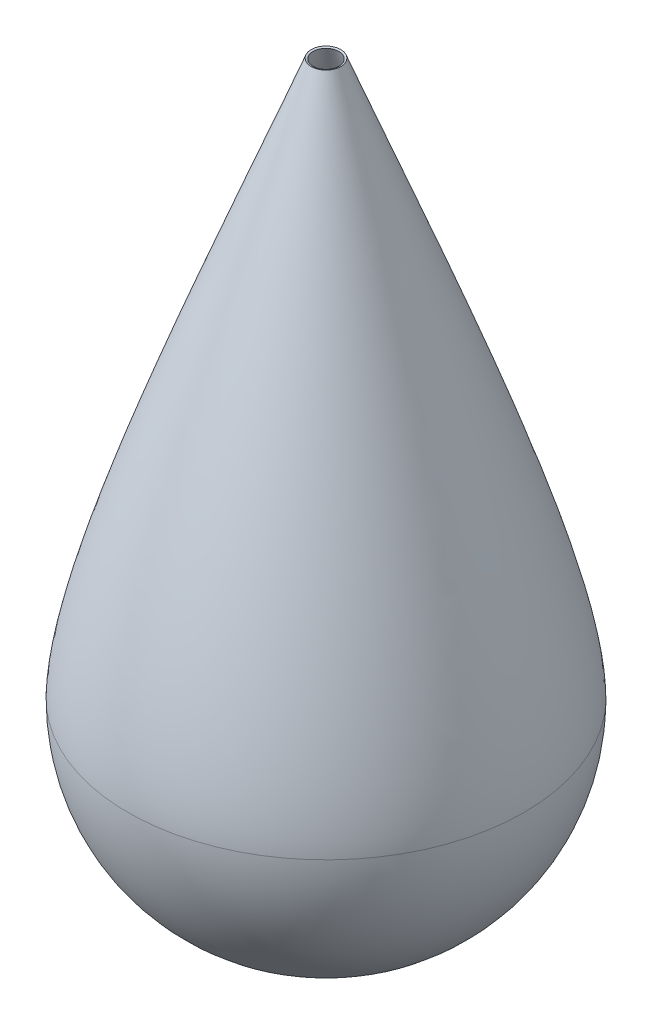
ISO-10303-21;
HEADER;
FILE_DESCRIPTION(('STEP AP214'),'2;1');
FILE_NAME('part.step','',(''),(''),'','','');
FILE_SCHEMA(('AUTOMOTIVE_DESIGN { 1 0 10303 214 1 1 1 1 }'));
ENDSEC;
DATA;
#1=APPLICATION_CONTEXT('core data for automotive mechanical design processes');
#2=APPLICATION_PROTOCOL_DEFINITION('international standard','automotive_design',2000,#1);
#3=PRODUCT_CONTEXT('',#1,'mechanical');
#4=PRODUCT('Part','Part','',(#3));
#5=PRODUCT_RELATED_PRODUCT_CATEGORY('part','',(#4));
#6=PRODUCT_DEFINITION_FORMATION('','',#4);
#7=PRODUCT_DEFINITION_CONTEXT('part definition',#1,'design');
#8=PRODUCT_DEFINITION('design','',#6,#7);
#9=PRODUCT_DEFINITION_SHAPE('','',#8);
#10=(LENGTH_UNIT() NAMED_UNIT(*) SI_UNIT(.MILLI.,.METRE.));
#11=(NAMED_UNIT(*) PLANE_ANGLE_UNIT() SI_UNIT($,.RADIAN.));
#12=(NAMED_UNIT(*) SI_UNIT($,.STERADIAN.) SOLID_ANGLE_UNIT());
#13=UNCERTAINTY_MEASURE_WITH_UNIT(LENGTH_MEASURE(1.E-05),#10,'distance_accuracy_value','');
#14=(GEOMETRIC_REPRESENTATION_CONTEXT(3) GLOBAL_UNCERTAINTY_ASSIGNED_CONTEXT((#13)) GLOBAL_UNIT_ASSIGNED_CONTEXT((#10,
#11,#12)) REPRESENTATION_CONTEXT('',''));
#15=CARTESIAN_POINT('',(0.,0.,0.));
#16=DIRECTION('',(0.,0.,1.));
#17=DIRECTION('',(1.,0.,0.));
#18=AXIS2_PLACEMENT_3D('',#15,#16,#17);
#19=CARTESIAN_POINT('',(100.,0.,0.));
#20=CARTESIAN_POINT('',(98.8520999475521,50.8387839613542,0.));
#21=CARTESIAN_POINT('',(43.3961870444127,185.792304912628,0.));
#22=CARTESIAN_POINT('',(7.4571516180163,280.,0.));
#23=B_SPLINE_CURVE_WITH_KNOTS('',3,(#19,#20,#21,#22),.UNSPECIFIED.,.F.,.F.,(4,4),(0.,1.),.UNSPECIFIED.);
#24=CARTESIAN_POINT('',(0.,0.,0.));
#25=DIRECTION('',(0.,-1.,0.));
#26=AXIS1_PLACEMENT('',#24,#25);
#27=SURFACE_OF_REVOLUTION('',#23,#26);
#28=CARTESIAN_POINT('',(-9.77614774876077E-13,280.,0.));
#29=DIRECTION('',(0.,-1.,0.));
#30=DIRECTION('',(1.,0.,0.));
#31=AXIS2_PLACEMENT_3D('',#28,#29,#30);
#32=CIRCLE('',#31,7.45715161801732);
#33=CARTESIAN_POINT('',(7.45715161801634,280.,0.));
#34=VERTEX_POINT('',#33);
#35=EDGE_CURVE('E46',#34,#34,#32,.T.);
#36=ORIENTED_EDGE('',*,*,#35,.T.);
#37=EDGE_LOOP('',(#36));
#38=FACE_BOUND('',#37,.T.);
#39=CARTESIAN_POINT('',(0.,-3.3690166589284E-13,0.));
#40=DIRECTION('',(0.,-1.,0.));
#41=DIRECTION('',(1.,0.,0.));
#42=AXIS2_PLACEMENT_3D('',#39,#40,#41);
#43=CIRCLE('',#42,100.);
#44=CARTESIAN_POINT('',(100.,0.,0.));
#45=VERTEX_POINT('',#44);
#46=EDGE_CURVE('E10',#45,#45,#43,.T.);
#47=ORIENTED_EDGE('',*,*,#46,.F.);
#48=EDGE_LOOP('',(#47));
#49=FACE_BOUND('',#48,.T.);
#50=ADVANCED_FACE('F31',(#38,#49),#27,.F.);
#51=CARTESIAN_POINT('',(0.,0.,0.));
#52=DIRECTION('',(0.,-1.,0.));
#53=DIRECTION('',(-1.,0.,0.));
#54=AXIS2_PLACEMENT_3D('',#51,#52,#53);
#55=SPHERICAL_SURFACE('',#54,100.);
#56=ORIENTED_EDGE('',*,*,#46,.T.);
#57=EDGE_LOOP('',(#56));
#58=FACE_BOUND('',#57,.T.);
#59=ADVANCED_FACE('F68',(#58),#55,.T.);
#60=CARTESIAN_POINT('',(0.,0.,0.));
#61=DIRECTION('',(0.,-1.,0.));
#62=DIRECTION('',(1.,0.,0.));
#63=AXIS2_PLACEMENT_3D('',#60,#61,#62);
#64=SPHERICAL_SURFACE('',#63,98.9999999999984);
#65=CARTESIAN_POINT('',(0.,-0.0112981859253688,0.));
#66=DIRECTION('',(0.,-1.,0.));
#67=DIRECTION('',(1.,0.,0.));
#68=AXIS2_PLACEMENT_3D('',#65,#66,#67);
#69=CIRCLE('',#68,98.9999993553065);
#70=CARTESIAN_POINT('',(98.9999993553065,-0.0112981859250232,0.));
#71=VERTEX_POINT('',#70);
#72=EDGE_CURVE('E38',#71,#71,#69,.T.);
#73=ORIENTED_EDGE('',*,*,#72,.F.);
#74=EDGE_LOOP('',(#73));
#75=FACE_BOUND('',#74,.T.);
#76=ADVANCED_FACE('F66',(#75),#64,.F.);
#77=CARTESIAN_POINT('',(6.52283023795812,279.643568297193,0.));
#78=CARTESIAN_POINT('',(7.08831634638889,278.161248522966,0.));
#79=CARTESIAN_POINT('',(8.21552878994888,275.21155003989,0.));
#80=CARTESIAN_POINT('',(10.5196545842646,269.200116569297,0.));
#81=CARTESIAN_POINT('',(13.4579367404002,261.563740483731,0.));
#82=CARTESIAN_POINT('',(17.0730518691206,252.202201599334,0.));
#83=CARTESIAN_POINT('',(21.9906665720899,239.495740074165,0.));
#84=CARTESIAN_POINT('',(28.2882437327057,223.244824822008,0.));
#85=CARTESIAN_POINT('',(35.9776607635961,203.339235117356,0.));
#86=CARTESIAN_POINT('',(43.6914320546751,183.211651478281,0.));
#87=CARTESIAN_POINT('',(53.8647111505395,156.322933157299,0.));
#88=CARTESIAN_POINT('',(63.6540908851109,129.72224460822,0.));
#89=CARTESIAN_POINT('',(72.6267934788295,104.142468116002,0.));
#90=CARTESIAN_POINT('',(78.8397349837966,85.6516386300772,0.));
#91=CARTESIAN_POINT('',(84.4278157771027,68.0386439171887,0.));
#92=CARTESIAN_POINT('',(89.2827282628937,51.4878787919105,0.));
#93=CARTESIAN_POINT('',(92.6272513695525,38.7351595948678,0.));
#94=CARTESIAN_POINT('',(94.8280437782162,29.2502913271582,0.));
#95=CARTESIAN_POINT('',(96.2277518420835,22.5189767277787,0.));
#96=CARTESIAN_POINT('',(97.3631635100307,16.193994458722,0.));
#97=CARTESIAN_POINT('',(98.0780292601728,11.281941509841,0.));
#98=CARTESIAN_POINT('',(98.5046291593947,7.58042059425427,0.));
#99=CARTESIAN_POINT('',(98.7503773322123,4.92067806748502,0.));
#100=CARTESIAN_POINT('',(98.8919834105532,2.80695021915507,0.));
#101=CARTESIAN_POINT('',(98.9667781018026,1.17253762969354,0.));
#102=CARTESIAN_POINT('',(98.9909684683781,0.385949144822083,0.));
#103=CARTESIAN_POINT('',(98.9999993553049,-0.0112981859250647,0.));
#104=B_SPLINE_CURVE_WITH_KNOTS('',3,(#77,#78,#79,#80,#81,#82,#83,#84,#85,#86,#87,#88,#89,#90,
#91,#92,#93,#94,#95,#96,#97,#98,#99,#100,#101,#102,#103),.UNSPECIFIED.,.F.,.F.,(4,1,1,1,1,1,1,1,
1,1,1,1,1,1,1,1,1,1,1,1,1,1,1,1,4),(7.49309027892606E-05,0.0156987601074332,0.031322589312077,
0.0625702477213649,0.0938179061306528,0.125065564539941,0.187560881358516,0.250056198177092,
0.312551514995668,0.375046831814243,0.500037465451395,0.56253278226997,0.625028099088546,
0.687523415907122,0.750018732725697,0.812514049544273,0.843761707953561,0.875009366362849,
0.906257024772136,0.937504683181424,0.953128512386068,0.968752341590712,0.984376170795356,
0.992188085397678,1.),.UNSPECIFIED.);
#105=CARTESIAN_POINT('',(0.,0.,0.));
#106=DIRECTION('',(0.,-1.,0.));
#107=AXIS1_PLACEMENT('',#105,#106);
#108=SURFACE_OF_REVOLUTION('',#104,#107);
#109=ORIENTED_EDGE('',*,*,#72,.T.);
#110=EDGE_LOOP('',(#109));
#111=FACE_BOUND('',#110,.T.);
#112=CARTESIAN_POINT('',(-9.76370300237154E-13,279.643568297193,0.));
#113=DIRECTION('',(0.,-1.,0.));
#114=DIRECTION('',(1.,0.,0.));
#115=AXIS2_PLACEMENT_3D('',#112,#113,#114);
#116=CIRCLE('',#115,6.52283023795909);
#117=CARTESIAN_POINT('',(6.52283023795812,279.643568297193,0.));
#118=VERTEX_POINT('',#117);
#119=EDGE_CURVE('E42',#118,#118,#116,.T.);
#120=ORIENTED_EDGE('',*,*,#119,.F.);
#121=EDGE_LOOP('',(#120));
#122=FACE_BOUND('',#121,.T.);
#123=ADVANCED_FACE('F61',(#111,#122),#108,.F.);
#124=CARTESIAN_POINT('',(-9.77614774876077E-13,280.,0.));
#125=DIRECTION('',(0.,1.,0.));
#126=DIRECTION('',(-1.,0.,0.));
#127=AXIS2_PLACEMENT_3D('',#124,#125,#126);
#128=CONICAL_SURFACE('',#127,7.45715161801732,1.20635036142508);
#129=ORIENTED_EDGE('',*,*,#119,.T.);
#130=EDGE_LOOP('',(#129));
#131=FACE_BOUND('',#130,.T.);
#132=ORIENTED_EDGE('',*,*,#35,.F.);
#133=EDGE_LOOP('',(#132));
#134=FACE_BOUND('',#133,.T.);
#135=ADVANCED_FACE('F65',(#131,#134),#128,.F.);
#136=CLOSED_SHELL('',(#50,#59,#76,#123,#135));
#137=MANIFOLD_SOLID_BREP('B2',#136);
#138=ADVANCED_BREP_SHAPE_REPRESENTATION('',(#18,#137),#14);
#139=SHAPE_DEFINITION_REPRESENTATION(#9,#138);
ENDSEC;
END-ISO-10303-21;
